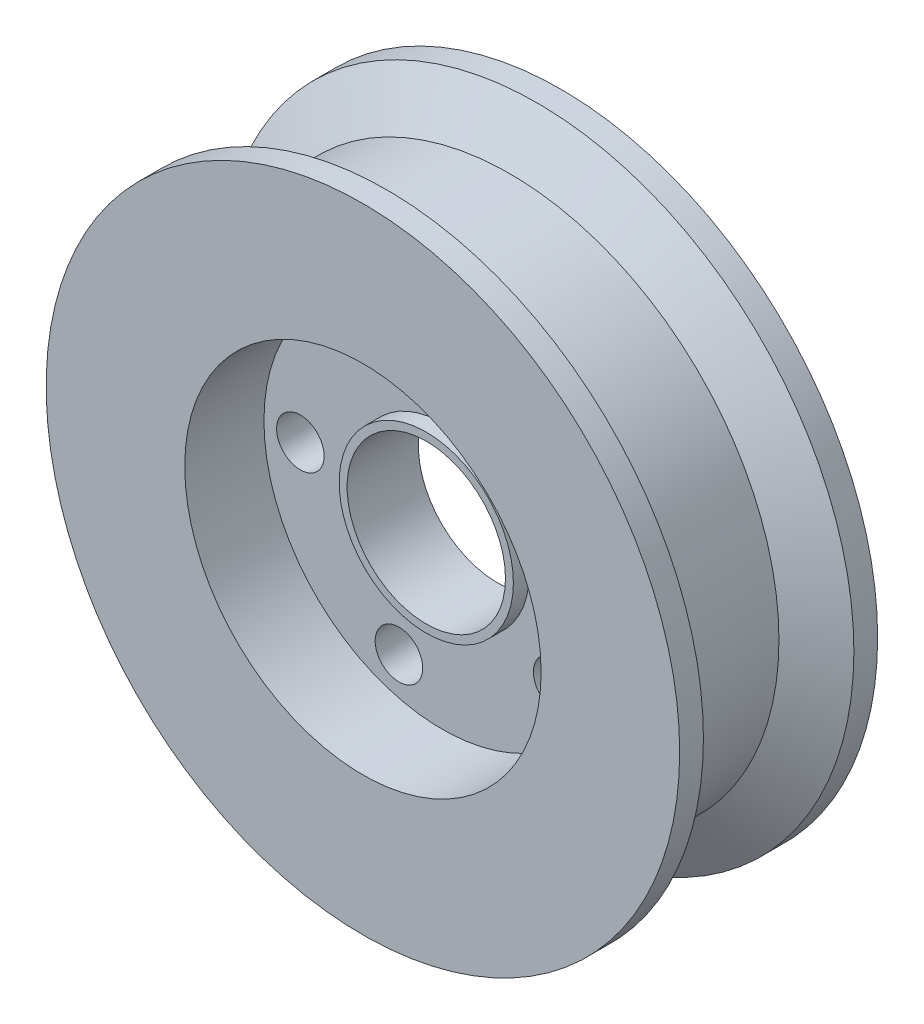
ISO-10303-21;
HEADER;
FILE_DESCRIPTION(('STEP AP214'),'2;1');
FILE_NAME('part.step','',(''),(''),'','','');
FILE_SCHEMA(('AUTOMOTIVE_DESIGN { 1 0 10303 214 1 1 1 1 }'));
ENDSEC;
DATA;
#1=APPLICATION_CONTEXT('core data for automotive mechanical design processes');
#2=APPLICATION_PROTOCOL_DEFINITION('international standard','automotive_design',2000,#1);
#3=PRODUCT_CONTEXT('',#1,'mechanical');
#4=PRODUCT('Part','Part','',(#3));
#5=PRODUCT_RELATED_PRODUCT_CATEGORY('part','',(#4));
#6=PRODUCT_DEFINITION_FORMATION('','',#4);
#7=PRODUCT_DEFINITION_CONTEXT('part definition',#1,'design');
#8=PRODUCT_DEFINITION('design','',#6,#7);
#9=PRODUCT_DEFINITION_SHAPE('','',#8);
#10=(LENGTH_UNIT() NAMED_UNIT(*) SI_UNIT(.MILLI.,.METRE.));
#11=(NAMED_UNIT(*) PLANE_ANGLE_UNIT() SI_UNIT($,.RADIAN.));
#12=(NAMED_UNIT(*) SI_UNIT($,.STERADIAN.) SOLID_ANGLE_UNIT());
#13=UNCERTAINTY_MEASURE_WITH_UNIT(LENGTH_MEASURE(1.E-05),#10,'distance_accuracy_value','');
#14=(GEOMETRIC_REPRESENTATION_CONTEXT(3) GLOBAL_UNCERTAINTY_ASSIGNED_CONTEXT((#13)) GLOBAL_UNIT_ASSIGNED_CONTEXT((#10,
#11,#12)) REPRESENTATION_CONTEXT('',''));
#15=CARTESIAN_POINT('',(0.,0.,0.));
#16=DIRECTION('',(0.,0.,1.));
#17=DIRECTION('',(1.,0.,0.));
#18=AXIS2_PLACEMENT_3D('',#15,#16,#17);
#19=CARTESIAN_POINT('',(0.,0.,12.5));
#20=DIRECTION('',(0.,0.,-1.));
#21=DIRECTION('',(-1.,0.,0.));
#22=AXIS2_PLACEMENT_3D('',#19,#20,#21);
#23=CYLINDRICAL_SURFACE('',#22,40.);
#24=CARTESIAN_POINT('',(0.,0.,12.5));
#25=DIRECTION('',(0.,0.,1.));
#26=DIRECTION('',(1.,0.,0.));
#27=AXIS2_PLACEMENT_3D('',#24,#25,#26);
#28=CIRCLE('',#27,40.);
#29=CARTESIAN_POINT('',(40.,0.,12.5));
#30=VERTEX_POINT('',#29);
#31=EDGE_CURVE('E48',#30,#30,#28,.T.);
#32=ORIENTED_EDGE('',*,*,#31,.F.);
#33=EDGE_LOOP('',(#32));
#34=FACE_BOUND('',#33,.T.);
#35=CARTESIAN_POINT('',(0.,0.,9.5));
#36=DIRECTION('',(0.,0.,1.));
#37=DIRECTION('',(1.,0.,0.));
#38=AXIS2_PLACEMENT_3D('',#35,#36,#37);
#39=CIRCLE('',#38,40.);
#40=CARTESIAN_POINT('',(40.,0.,9.5));
#41=VERTEX_POINT('',#40);
#42=EDGE_CURVE('E148',#41,#41,#39,.T.);
#43=ORIENTED_EDGE('',*,*,#42,.T.);
#44=EDGE_LOOP('',(#43));
#45=FACE_BOUND('',#44,.T.);
#46=ADVANCED_FACE('F37',(#34,#45),#23,.T.);
#47=CARTESIAN_POINT('',(0.,0.,-12.5));
#48=DIRECTION('',(0.,0.,1.));
#49=DIRECTION('',(1.,0.,0.));
#50=AXIS2_PLACEMENT_3D('',#47,#48,#49);
#51=CIRCLE('',#50,40.);
#52=CARTESIAN_POINT('',(40.,0.,-12.5));
#53=VERTEX_POINT('',#52);
#54=EDGE_CURVE('E83',#53,#53,#51,.T.);
#55=ORIENTED_EDGE('',*,*,#54,.T.);
#56=EDGE_LOOP('',(#55));
#57=FACE_BOUND('',#56,.T.);
#58=CARTESIAN_POINT('',(0.,0.,-9.5));
#59=DIRECTION('',(0.,0.,1.));
#60=DIRECTION('',(1.,0.,0.));
#61=AXIS2_PLACEMENT_3D('',#58,#59,#60);
#62=CIRCLE('',#61,40.);
#63=CARTESIAN_POINT('',(40.,0.,-9.5));
#64=VERTEX_POINT('',#63);
#65=EDGE_CURVE('E354',#64,#64,#62,.T.);
#66=ORIENTED_EDGE('',*,*,#65,.F.);
#67=EDGE_LOOP('',(#66));
#68=FACE_BOUND('',#67,.T.);
#69=ADVANCED_FACE('F129',(#57,#68),#23,.T.);
#70=CARTESIAN_POINT('',(0.,0.,-12.5));
#71=DIRECTION('',(0.,0.,1.));
#72=DIRECTION('',(1.,0.,0.));
#73=AXIS2_PLACEMENT_3D('',#70,#71,#72);
#74=PLANE('',#73);
#75=ORIENTED_EDGE('',*,*,#54,.F.);
#76=EDGE_LOOP('',(#75));
#77=FACE_BOUND('',#76,.T.);
#78=CARTESIAN_POINT('',(0.,0.,-12.5));
#79=DIRECTION('',(0.,0.,1.));
#80=DIRECTION('',(1.,0.,0.));
#81=AXIS2_PLACEMENT_3D('',#78,#79,#80);
#82=CIRCLE('',#81,22.5);
#83=CARTESIAN_POINT('',(22.5,0.,-12.5));
#84=VERTEX_POINT('',#83);
#85=EDGE_CURVE('E77',#84,#84,#82,.T.);
#86=ORIENTED_EDGE('',*,*,#85,.T.);
#87=EDGE_LOOP('',(#86));
#88=FACE_BOUND('',#87,.T.);
#89=ADVANCED_FACE('F126',(#77,#88),#74,.F.);
#90=CARTESIAN_POINT('',(0.,0.,12.5));
#91=DIRECTION('',(0.,0.,1.));
#92=DIRECTION('',(1.,0.,0.));
#93=AXIS2_PLACEMENT_3D('',#90,#91,#92);
#94=PLANE('',#93);
#95=CARTESIAN_POINT('',(0.,0.,12.5));
#96=DIRECTION('',(0.,0.,1.));
#97=DIRECTION('',(1.,0.,0.));
#98=AXIS2_PLACEMENT_3D('',#95,#96,#97);
#99=CIRCLE('',#98,22.5);
#100=CARTESIAN_POINT('',(22.5,0.,12.5));
#101=VERTEX_POINT('',#100);
#102=EDGE_CURVE('E76',#101,#101,#99,.T.);
#103=ORIENTED_EDGE('',*,*,#102,.F.);
#104=EDGE_LOOP('',(#103));
#105=FACE_BOUND('',#104,.T.);
#106=ORIENTED_EDGE('',*,*,#31,.T.);
#107=EDGE_LOOP('',(#106));
#108=FACE_BOUND('',#107,.T.);
#109=ADVANCED_FACE('F128',(#105,#108),#94,.T.);
#110=CARTESIAN_POINT('',(0.,0.,2.5));
#111=DIRECTION('',(0.,0.,1.));
#112=DIRECTION('',(1.,0.,0.));
#113=AXIS2_PLACEMENT_3D('',#110,#111,#112);
#114=CYLINDRICAL_SURFACE('',#113,22.5);
#115=CARTESIAN_POINT('',(0.,0.,2.5));
#116=DIRECTION('',(0.,0.,1.));
#117=DIRECTION('',(1.,0.,0.));
#118=AXIS2_PLACEMENT_3D('',#115,#116,#117);
#119=CIRCLE('',#118,22.5);
#120=CARTESIAN_POINT('',(22.5,0.,2.5));
#121=VERTEX_POINT('',#120);
#122=EDGE_CURVE('E80',#121,#121,#119,.T.);
#123=ORIENTED_EDGE('',*,*,#122,.F.);
#124=EDGE_LOOP('',(#123));
#125=FACE_BOUND('',#124,.T.);
#126=ORIENTED_EDGE('',*,*,#102,.T.);
#127=EDGE_LOOP('',(#126));
#128=FACE_BOUND('',#127,.T.);
#129=ADVANCED_FACE('F135',(#125,#128),#114,.F.);
#130=CARTESIAN_POINT('',(0.,0.,2.5));
#131=DIRECTION('',(0.,0.,1.));
#132=DIRECTION('',(1.,0.,0.));
#133=AXIS2_PLACEMENT_3D('',#130,#131,#132);
#134=PLANE('',#133);
#135=CARTESIAN_POINT('',(0.,0.,2.5));
#136=DIRECTION('',(0.,0.,1.));
#137=DIRECTION('',(1.,0.,0.));
#138=AXIS2_PLACEMENT_3D('',#135,#136,#137);
#139=CIRCLE('',#138,11.);
#140=CARTESIAN_POINT('',(11.,0.,2.5));
#141=VERTEX_POINT('',#140);
#142=EDGE_CURVE('E11',#141,#141,#139,.T.);
#143=ORIENTED_EDGE('',*,*,#142,.F.);
#144=EDGE_LOOP('',(#143));
#145=FACE_BOUND('',#144,.T.);
#146=CARTESIAN_POINT('',(-17.9017776136443,-0.082850630188919,2.5));
#147=DIRECTION('',(0.,0.,1.));
#148=DIRECTION('',(0.309016994374958,0.95105651629515,0.));
#149=AXIS2_PLACEMENT_3D('',#146,#147,#148);
#150=CIRCLE('',#149,3.);
#151=CARTESIAN_POINT('',(-14.9017776136443,-0.082850630188919,2.5));
#152=VERTEX_POINT('',#151);
#153=EDGE_CURVE('E53',#152,#152,#150,.T.);
#154=ORIENTED_EDGE('',*,*,#153,.F.);
#155=EDGE_LOOP('',(#154));
#156=FACE_BOUND('',#155,.T.);
#157=CARTESIAN_POINT('',(-5.4531578804167,-17.0512045054462,2.5));
#158=DIRECTION('',(0.,0.,1.));
#159=DIRECTION('',(-0.809016994374942,0.58778525229248,0.));
#160=AXIS2_PLACEMENT_3D('',#157,#158,#159);
#161=CIRCLE('',#160,3.);
#162=CARTESIAN_POINT('',(-2.4531578804167,-17.0512045054462,2.5));
#163=VERTEX_POINT('',#162);
#164=EDGE_CURVE('E57',#163,#163,#161,.T.);
#165=ORIENTED_EDGE('',*,*,#164,.F.);
#166=EDGE_LOOP('',(#165));
#167=FACE_BOUND('',#166,.T.);
#168=CARTESIAN_POINT('',(14.5315406975275,-10.4553733033021,2.5));
#169=DIRECTION('',(0.,0.,1.));
#170=DIRECTION('',(-0.809016994374951,-0.587785252292469,0.));
#171=AXIS2_PLACEMENT_3D('',#168,#169,#170);
#172=CIRCLE('',#171,3.);
#173=CARTESIAN_POINT('',(17.5315406975275,-10.4553733033021,2.5));
#174=VERTEX_POINT('',#173);
#175=EDGE_CURVE('E61',#174,#174,#172,.T.);
#176=ORIENTED_EDGE('',*,*,#175,.F.);
#177=EDGE_LOOP('',(#176));
#178=FACE_BOUND('',#177,.T.);
#179=CARTESIAN_POINT('',(14.434143940391,10.5894284389373,2.5));
#180=DIRECTION('',(0.,0.,1.));
#181=DIRECTION('',(0.309016994374945,-0.951056516295155,0.));
#182=AXIS2_PLACEMENT_3D('',#179,#180,#181);
#183=CIRCLE('',#182,3.);
#184=CARTESIAN_POINT('',(17.434143940391,10.5894284389373,2.5));
#185=VERTEX_POINT('',#184);
#186=EDGE_CURVE('E65',#185,#185,#183,.T.);
#187=ORIENTED_EDGE('',*,*,#186,.F.);
#188=EDGE_LOOP('',(#187));
#189=FACE_BOUND('',#188,.T.);
#190=CARTESIAN_POINT('',(-5.6107491438576,17.,2.5));
#191=DIRECTION('',(0.,0.,1.));
#192=DIRECTION('',(1.,0.,0.));
#193=AXIS2_PLACEMENT_3D('',#190,#191,#192);
#194=CIRCLE('',#193,3.);
#195=CARTESIAN_POINT('',(-2.6107491438576,17.,2.5));
#196=VERTEX_POINT('',#195);
#197=EDGE_CURVE('E69',#196,#196,#194,.T.);
#198=ORIENTED_EDGE('',*,*,#197,.F.);
#199=EDGE_LOOP('',(#198));
#200=FACE_BOUND('',#199,.T.);
#201=ORIENTED_EDGE('',*,*,#122,.T.);
#202=EDGE_LOOP('',(#201));
#203=FACE_BOUND('',#202,.T.);
#204=ADVANCED_FACE('F122',(#145,#156,#167,#178,#189,#200,#203),#134,.T.);
#205=CARTESIAN_POINT('',(0.,0.,-2.5));
#206=DIRECTION('',(0.,0.,-1.));
#207=DIRECTION('',(-1.,0.,0.));
#208=AXIS2_PLACEMENT_3D('',#205,#206,#207);
#209=CYLINDRICAL_SURFACE('',#208,22.5);
#210=CARTESIAN_POINT('',(0.,0.,-2.5));
#211=DIRECTION('',(0.,0.,1.));
#212=DIRECTION('',(1.,0.,0.));
#213=AXIS2_PLACEMENT_3D('',#210,#211,#212);
#214=CIRCLE('',#213,22.5);
#215=CARTESIAN_POINT('',(22.5,0.,-2.5));
#216=VERTEX_POINT('',#215);
#217=EDGE_CURVE('E73',#216,#216,#214,.T.);
#218=ORIENTED_EDGE('',*,*,#217,.T.);
#219=EDGE_LOOP('',(#218));
#220=FACE_BOUND('',#219,.T.);
#221=ORIENTED_EDGE('',*,*,#85,.F.);
#222=EDGE_LOOP('',(#221));
#223=FACE_BOUND('',#222,.T.);
#224=ADVANCED_FACE('F107',(#220,#223),#209,.F.);
#225=CARTESIAN_POINT('',(0.,0.,-2.5));
#226=DIRECTION('',(0.,0.,-1.));
#227=DIRECTION('',(1.,0.,0.));
#228=AXIS2_PLACEMENT_3D('',#225,#226,#227);
#229=PLANE('',#228);
#230=CARTESIAN_POINT('',(0.,0.,-2.5));
#231=DIRECTION('',(0.,0.,-1.));
#232=DIRECTION('',(-1.,0.,0.));
#233=AXIS2_PLACEMENT_3D('',#230,#231,#232);
#234=CIRCLE('',#233,11.);
#235=CARTESIAN_POINT('',(-11.,0.,-2.5));
#236=VERTEX_POINT('',#235);
#237=EDGE_CURVE('E40',#236,#236,#234,.T.);
#238=ORIENTED_EDGE('',*,*,#237,.F.);
#239=EDGE_LOOP('',(#238));
#240=FACE_BOUND('',#239,.T.);
#241=CARTESIAN_POINT('',(-17.9017776136443,-0.082850630188919,-2.5));
#242=DIRECTION('',(0.,0.,-1.));
#243=DIRECTION('',(-1.,0.,0.));
#244=AXIS2_PLACEMENT_3D('',#241,#242,#243);
#245=CIRCLE('',#244,3.);
#246=CARTESIAN_POINT('',(-14.9017776136443,-0.082850630188919,-2.5));
#247=VERTEX_POINT('',#246);
#248=EDGE_CURVE('E56',#247,#247,#245,.T.);
#249=ORIENTED_EDGE('',*,*,#248,.F.);
#250=EDGE_LOOP('',(#249));
#251=FACE_BOUND('',#250,.T.);
#252=CARTESIAN_POINT('',(-5.4531578804167,-17.0512045054462,-2.5));
#253=DIRECTION('',(0.,0.,-1.));
#254=DIRECTION('',(-1.,0.,0.));
#255=AXIS2_PLACEMENT_3D('',#252,#253,#254);
#256=CIRCLE('',#255,3.);
#257=CARTESIAN_POINT('',(-2.4531578804167,-17.0512045054462,-2.5));
#258=VERTEX_POINT('',#257);
#259=EDGE_CURVE('E60',#258,#258,#256,.T.);
#260=ORIENTED_EDGE('',*,*,#259,.F.);
#261=EDGE_LOOP('',(#260));
#262=FACE_BOUND('',#261,.T.);
#263=CARTESIAN_POINT('',(14.5315406975275,-10.4553733033021,-2.5));
#264=DIRECTION('',(0.,0.,-1.));
#265=DIRECTION('',(-1.,0.,0.));
#266=AXIS2_PLACEMENT_3D('',#263,#264,#265);
#267=CIRCLE('',#266,3.);
#268=CARTESIAN_POINT('',(17.5315406975275,-10.4553733033021,-2.5));
#269=VERTEX_POINT('',#268);
#270=EDGE_CURVE('E64',#269,#269,#267,.T.);
#271=ORIENTED_EDGE('',*,*,#270,.F.);
#272=EDGE_LOOP('',(#271));
#273=FACE_BOUND('',#272,.T.);
#274=CARTESIAN_POINT('',(14.434143940391,10.5894284389373,-2.5));
#275=DIRECTION('',(0.,0.,-1.));
#276=DIRECTION('',(-1.,0.,0.));
#277=AXIS2_PLACEMENT_3D('',#274,#275,#276);
#278=CIRCLE('',#277,3.);
#279=CARTESIAN_POINT('',(17.434143940391,10.5894284389373,-2.5));
#280=VERTEX_POINT('',#279);
#281=EDGE_CURVE('E68',#280,#280,#278,.T.);
#282=ORIENTED_EDGE('',*,*,#281,.F.);
#283=EDGE_LOOP('',(#282));
#284=FACE_BOUND('',#283,.T.);
#285=CARTESIAN_POINT('',(-5.6107491438576,17.,-2.5));
#286=DIRECTION('',(0.,0.,-1.));
#287=DIRECTION('',(-1.,0.,0.));
#288=AXIS2_PLACEMENT_3D('',#285,#286,#287);
#289=CIRCLE('',#288,3.);
#290=CARTESIAN_POINT('',(-2.6107491438576,17.,-2.5));
#291=VERTEX_POINT('',#290);
#292=EDGE_CURVE('E72',#291,#291,#289,.T.);
#293=ORIENTED_EDGE('',*,*,#292,.F.);
#294=EDGE_LOOP('',(#293));
#295=FACE_BOUND('',#294,.T.);
#296=ORIENTED_EDGE('',*,*,#217,.F.);
#297=EDGE_LOOP('',(#296));
#298=FACE_BOUND('',#297,.T.);
#299=ADVANCED_FACE('F103',(#240,#251,#262,#273,#284,#295,#298),#229,.T.);
#300=CARTESIAN_POINT('',(-5.6107491438576,17.,-12.5));
#301=DIRECTION('',(0.,0.,1.));
#302=DIRECTION('',(1.,0.,0.));
#303=AXIS2_PLACEMENT_3D('',#300,#301,#302);
#304=CYLINDRICAL_SURFACE('',#303,3.);
#305=CARTESIAN_POINT('',(-2.6107491438576,17.,-2.5));
#306=CARTESIAN_POINT('',(-2.6107491438576,17.,-2.44791666666667));
#307=CARTESIAN_POINT('',(-2.6107491438576,17.,-2.39583333333333));
#308=CARTESIAN_POINT('',(-2.6107491438576,17.,-2.29166666666667));
#309=CARTESIAN_POINT('',(-2.6107491438576,17.,-2.23958333333333));
#310=CARTESIAN_POINT('',(-2.6107491438576,17.,-2.13541666666667));
#311=CARTESIAN_POINT('',(-2.6107491438576,17.,-2.08333333333333));
#312=CARTESIAN_POINT('',(-2.6107491438576,17.,-1.97916666666667));
#313=CARTESIAN_POINT('',(-2.6107491438576,17.,-1.92708333333333));
#314=CARTESIAN_POINT('',(-2.6107491438576,17.,-1.82291666666667));
#315=CARTESIAN_POINT('',(-2.6107491438576,17.,-1.77083333333333));
#316=CARTESIAN_POINT('',(-2.6107491438576,17.,-1.66666666666667));
#317=CARTESIAN_POINT('',(-2.6107491438576,17.,-1.61458333333333));
#318=CARTESIAN_POINT('',(-2.6107491438576,17.,-1.51041666666667));
#319=CARTESIAN_POINT('',(-2.6107491438576,17.,-1.45833333333333));
#320=CARTESIAN_POINT('',(-2.6107491438576,17.,-1.35416666666667));
#321=CARTESIAN_POINT('',(-2.6107491438576,17.,-1.30208333333333));
#322=CARTESIAN_POINT('',(-2.6107491438576,17.,-1.19791666666667));
#323=CARTESIAN_POINT('',(-2.6107491438576,17.,-1.14583333333333));
#324=CARTESIAN_POINT('',(-2.6107491438576,17.,-1.04166666666667));
#325=CARTESIAN_POINT('',(-2.6107491438576,17.,-0.989583333333334));
#326=CARTESIAN_POINT('',(-2.6107491438576,17.,-0.885416666666668));
#327=CARTESIAN_POINT('',(-2.6107491438576,17.,-0.833333333333334));
#328=CARTESIAN_POINT('',(-2.6107491438576,17.,-0.729166666666667));
#329=CARTESIAN_POINT('',(-2.6107491438576,17.,-0.677083333333334));
#330=CARTESIAN_POINT('',(-2.6107491438576,17.,-0.572916666666667));
#331=CARTESIAN_POINT('',(-2.6107491438576,17.,-0.520833333333334));
#332=CARTESIAN_POINT('',(-2.6107491438576,17.,-0.416666666666667));
#333=CARTESIAN_POINT('',(-2.6107491438576,17.,-0.364583333333334));
#334=CARTESIAN_POINT('',(-2.6107491438576,17.,-0.260416666666667));
#335=CARTESIAN_POINT('',(-2.6107491438576,17.,-0.208333333333334));
#336=CARTESIAN_POINT('',(-2.6107491438576,17.,-0.104166666666667));
#337=CARTESIAN_POINT('',(-2.6107491438576,17.,-0.0520833333333334));
#338=CARTESIAN_POINT('',(-2.6107491438576,17.,0.0520833333333334));
#339=CARTESIAN_POINT('',(-2.6107491438576,17.,0.104166666666667));
#340=CARTESIAN_POINT('',(-2.6107491438576,17.,0.208333333333334));
#341=CARTESIAN_POINT('',(-2.6107491438576,17.,0.260416666666667));
#342=CARTESIAN_POINT('',(-2.6107491438576,17.,0.364583333333334));
#343=CARTESIAN_POINT('',(-2.6107491438576,17.,0.416666666666667));
#344=CARTESIAN_POINT('',(-2.6107491438576,17.,0.520833333333334));
#345=CARTESIAN_POINT('',(-2.6107491438576,17.,0.572916666666667));
#346=CARTESIAN_POINT('',(-2.6107491438576,17.,0.677083333333334));
#347=CARTESIAN_POINT('',(-2.6107491438576,17.,0.729166666666667));
#348=CARTESIAN_POINT('',(-2.6107491438576,17.,0.833333333333333));
#349=CARTESIAN_POINT('',(-2.6107491438576,17.,0.885416666666666));
#350=CARTESIAN_POINT('',(-2.6107491438576,17.,0.989583333333333));
#351=CARTESIAN_POINT('',(-2.6107491438576,17.,1.04166666666667));
#352=CARTESIAN_POINT('',(-2.6107491438576,17.,1.14583333333333));
#353=CARTESIAN_POINT('',(-2.6107491438576,17.,1.19791666666667));
#354=CARTESIAN_POINT('',(-2.6107491438576,17.,1.30208333333333));
#355=CARTESIAN_POINT('',(-2.6107491438576,17.,1.35416666666667));
#356=CARTESIAN_POINT('',(-2.6107491438576,17.,1.45833333333333));
#357=CARTESIAN_POINT('',(-2.6107491438576,17.,1.51041666666667));
#358=CARTESIAN_POINT('',(-2.6107491438576,17.,1.61458333333333));
#359=CARTESIAN_POINT('',(-2.6107491438576,17.,1.66666666666667));
#360=CARTESIAN_POINT('',(-2.6107491438576,17.,1.77083333333333));
#361=CARTESIAN_POINT('',(-2.6107491438576,17.,1.82291666666667));
#362=CARTESIAN_POINT('',(-2.6107491438576,17.,1.92708333333333));
#363=CARTESIAN_POINT('',(-2.6107491438576,17.,1.97916666666667));
#364=CARTESIAN_POINT('',(-2.6107491438576,17.,2.08333333333333));
#365=CARTESIAN_POINT('',(-2.6107491438576,17.,2.13541666666667));
#366=CARTESIAN_POINT('',(-2.6107491438576,17.,2.23958333333333));
#367=CARTESIAN_POINT('',(-2.6107491438576,17.,2.29166666666667));
#368=CARTESIAN_POINT('',(-2.6107491438576,17.,2.39583333333333));
#369=CARTESIAN_POINT('',(-2.6107491438576,17.,2.44791666666667));
#370=CARTESIAN_POINT('',(-2.6107491438576,17.,2.5));
#371=B_SPLINE_CURVE_WITH_KNOTS('',3,(#305,#306,#307,#308,#309,#310,#311,#312,#313,#314,#315,
#316,#317,#318,#319,#320,#321,#322,#323,#324,#325,#326,#327,#328,#329,#330,#331,#332,#333,#334,
#335,#336,#337,#338,#339,#340,#341,#342,#343,#344,#345,#346,#347,#348,#349,#350,#351,#352,#353,
#354,#355,#356,#357,#358,#359,#360,#361,#362,#363,#364,#365,#366,#367,#368,#369,#370),
.UNSPECIFIED.,.F.,.F.,(4,2,2,2,2,2,2,2,2,2,2,2,2,2,2,2,2,2,2,2,2,2,2,2,2,2,2,2,2,2,2,2,4),(0.,
0.15625,0.3125,0.46875,0.625000000000001,0.781250000000001,0.937500000000001,1.09375,1.25,
1.40625,1.5625,1.71875,1.875,2.03125,2.1875,2.34375,2.5,2.65625,2.8125,2.96875,3.125,3.28125,
3.4375,3.59375,3.75,3.90625,4.0625,4.21875,4.375,4.53125,4.6875,4.84375,5.),.UNSPECIFIED.);
#372=EDGE_CURVE('BSEAM106',#291,#196,#371,.T.);
#373=ORIENTED_EDGE('',*,*,#292,.T.);
#374=ORIENTED_EDGE('',*,*,#197,.T.);
#375=ORIENTED_EDGE('',*,*,#372,.T.);
#376=ORIENTED_EDGE('',*,*,#372,.F.);
#377=EDGE_LOOP('',(#373,#375,#374,#376));
#378=FACE_BOUND('',#377,.T.);
#379=ADVANCED_FACE('F106',(#378),#304,.F.);
#380=CARTESIAN_POINT('',(14.434143940391,10.5894284389373,-12.5));
#381=DIRECTION('',(0.,0.,1.));
#382=DIRECTION('',(1.,0.,0.));
#383=AXIS2_PLACEMENT_3D('',#380,#381,#382);
#384=CYLINDRICAL_SURFACE('',#383,3.);
#385=CARTESIAN_POINT('',(17.434143940391,10.5894284389373,-2.5));
#386=CARTESIAN_POINT('',(17.434143940391,10.5894284389373,-2.44791666666667));
#387=CARTESIAN_POINT('',(17.434143940391,10.5894284389373,-2.39583333333333));
#388=CARTESIAN_POINT('',(17.434143940391,10.5894284389373,-2.29166666666667));
#389=CARTESIAN_POINT('',(17.434143940391,10.5894284389373,-2.23958333333333));
#390=CARTESIAN_POINT('',(17.434143940391,10.5894284389373,-2.13541666666667));
#391=CARTESIAN_POINT('',(17.434143940391,10.5894284389373,-2.08333333333333));
#392=CARTESIAN_POINT('',(17.434143940391,10.5894284389373,-1.97916666666667));
#393=CARTESIAN_POINT('',(17.434143940391,10.5894284389373,-1.92708333333333));
#394=CARTESIAN_POINT('',(17.434143940391,10.5894284389373,-1.82291666666667));
#395=CARTESIAN_POINT('',(17.434143940391,10.5894284389373,-1.77083333333333));
#396=CARTESIAN_POINT('',(17.434143940391,10.5894284389373,-1.66666666666667));
#397=CARTESIAN_POINT('',(17.434143940391,10.5894284389373,-1.61458333333333));
#398=CARTESIAN_POINT('',(17.434143940391,10.5894284389373,-1.51041666666667));
#399=CARTESIAN_POINT('',(17.434143940391,10.5894284389373,-1.45833333333333));
#400=CARTESIAN_POINT('',(17.434143940391,10.5894284389373,-1.35416666666667));
#401=CARTESIAN_POINT('',(17.434143940391,10.5894284389373,-1.30208333333333));
#402=CARTESIAN_POINT('',(17.434143940391,10.5894284389373,-1.19791666666667));
#403=CARTESIAN_POINT('',(17.434143940391,10.5894284389373,-1.14583333333333));
#404=CARTESIAN_POINT('',(17.434143940391,10.5894284389373,-1.04166666666667));
#405=CARTESIAN_POINT('',(17.434143940391,10.5894284389373,-0.989583333333334));
#406=CARTESIAN_POINT('',(17.434143940391,10.5894284389373,-0.885416666666668));
#407=CARTESIAN_POINT('',(17.434143940391,10.5894284389373,-0.833333333333334));
#408=CARTESIAN_POINT('',(17.434143940391,10.5894284389373,-0.729166666666667));
#409=CARTESIAN_POINT('',(17.434143940391,10.5894284389373,-0.677083333333334));
#410=CARTESIAN_POINT('',(17.434143940391,10.5894284389373,-0.572916666666667));
#411=CARTESIAN_POINT('',(17.434143940391,10.5894284389373,-0.520833333333334));
#412=CARTESIAN_POINT('',(17.434143940391,10.5894284389373,-0.416666666666667));
#413=CARTESIAN_POINT('',(17.434143940391,10.5894284389373,-0.364583333333334));
#414=CARTESIAN_POINT('',(17.434143940391,10.5894284389373,-0.260416666666667));
#415=CARTESIAN_POINT('',(17.434143940391,10.5894284389373,-0.208333333333334));
#416=CARTESIAN_POINT('',(17.434143940391,10.5894284389373,-0.104166666666667));
#417=CARTESIAN_POINT('',(17.434143940391,10.5894284389373,-0.0520833333333334));
#418=CARTESIAN_POINT('',(17.434143940391,10.5894284389373,0.0520833333333334));
#419=CARTESIAN_POINT('',(17.434143940391,10.5894284389373,0.104166666666667));
#420=CARTESIAN_POINT('',(17.434143940391,10.5894284389373,0.208333333333334));
#421=CARTESIAN_POINT('',(17.434143940391,10.5894284389373,0.260416666666667));
#422=CARTESIAN_POINT('',(17.434143940391,10.5894284389373,0.364583333333334));
#423=CARTESIAN_POINT('',(17.434143940391,10.5894284389373,0.416666666666667));
#424=CARTESIAN_POINT('',(17.434143940391,10.5894284389373,0.520833333333334));
#425=CARTESIAN_POINT('',(17.434143940391,10.5894284389373,0.572916666666667));
#426=CARTESIAN_POINT('',(17.434143940391,10.5894284389373,0.677083333333334));
#427=CARTESIAN_POINT('',(17.434143940391,10.5894284389373,0.729166666666667));
#428=CARTESIAN_POINT('',(17.434143940391,10.5894284389373,0.833333333333333));
#429=CARTESIAN_POINT('',(17.434143940391,10.5894284389373,0.885416666666666));
#430=CARTESIAN_POINT('',(17.434143940391,10.5894284389373,0.989583333333333));
#431=CARTESIAN_POINT('',(17.434143940391,10.5894284389373,1.04166666666667));
#432=CARTESIAN_POINT('',(17.434143940391,10.5894284389373,1.14583333333333));
#433=CARTESIAN_POINT('',(17.434143940391,10.5894284389373,1.19791666666667));
#434=CARTESIAN_POINT('',(17.434143940391,10.5894284389373,1.30208333333333));
#435=CARTESIAN_POINT('',(17.434143940391,10.5894284389373,1.35416666666667));
#436=CARTESIAN_POINT('',(17.434143940391,10.5894284389373,1.45833333333333));
#437=CARTESIAN_POINT('',(17.434143940391,10.5894284389373,1.51041666666667));
#438=CARTESIAN_POINT('',(17.434143940391,10.5894284389373,1.61458333333333));
#439=CARTESIAN_POINT('',(17.434143940391,10.5894284389373,1.66666666666667));
#440=CARTESIAN_POINT('',(17.434143940391,10.5894284389373,1.77083333333333));
#441=CARTESIAN_POINT('',(17.434143940391,10.5894284389373,1.82291666666667));
#442=CARTESIAN_POINT('',(17.434143940391,10.5894284389373,1.92708333333333));
#443=CARTESIAN_POINT('',(17.434143940391,10.5894284389373,1.97916666666667));
#444=CARTESIAN_POINT('',(17.434143940391,10.5894284389373,2.08333333333333));
#445=CARTESIAN_POINT('',(17.434143940391,10.5894284389373,2.13541666666667));
#446=CARTESIAN_POINT('',(17.434143940391,10.5894284389373,2.23958333333333));
#447=CARTESIAN_POINT('',(17.434143940391,10.5894284389373,2.29166666666667));
#448=CARTESIAN_POINT('',(17.434143940391,10.5894284389373,2.39583333333333));
#449=CARTESIAN_POINT('',(17.434143940391,10.5894284389373,2.44791666666667));
#450=CARTESIAN_POINT('',(17.434143940391,10.5894284389373,2.5));
#451=B_SPLINE_CURVE_WITH_KNOTS('',3,(#385,#386,#387,#388,#389,#390,#391,#392,#393,#394,#395,
#396,#397,#398,#399,#400,#401,#402,#403,#404,#405,#406,#407,#408,#409,#410,#411,#412,#413,#414,
#415,#416,#417,#418,#419,#420,#421,#422,#423,#424,#425,#426,#427,#428,#429,#430,#431,#432,#433,
#434,#435,#436,#437,#438,#439,#440,#441,#442,#443,#444,#445,#446,#447,#448,#449,#450),
.UNSPECIFIED.,.F.,.F.,(4,2,2,2,2,2,2,2,2,2,2,2,2,2,2,2,2,2,2,2,2,2,2,2,2,2,2,2,2,2,2,2,4),(0.,
0.15625,0.3125,0.46875,0.625000000000001,0.781250000000001,0.937500000000001,1.09375,1.25,
1.40625,1.5625,1.71875,1.875,2.03125,2.1875,2.34375,2.5,2.65625,2.8125,2.96875,3.125,3.28125,
3.4375,3.59375,3.75,3.90625,4.0625,4.21875,4.375,4.53125,4.6875,4.84375,5.),.UNSPECIFIED.);
#452=EDGE_CURVE('BSEAM194',#280,#185,#451,.T.);
#453=ORIENTED_EDGE('',*,*,#281,.T.);
#454=ORIENTED_EDGE('',*,*,#186,.T.);
#455=ORIENTED_EDGE('',*,*,#452,.T.);
#456=ORIENTED_EDGE('',*,*,#452,.F.);
#457=EDGE_LOOP('',(#453,#455,#454,#456));
#458=FACE_BOUND('',#457,.T.);
#459=ADVANCED_FACE('F194',(#458),#384,.F.);
#460=CARTESIAN_POINT('',(14.5315406975275,-10.4553733033021,-12.5));
#461=DIRECTION('',(0.,0.,1.));
#462=DIRECTION('',(1.,0.,0.));
#463=AXIS2_PLACEMENT_3D('',#460,#461,#462);
#464=CYLINDRICAL_SURFACE('',#463,3.);
#465=CARTESIAN_POINT('',(17.5315406975275,-10.4553733033021,-2.5));
#466=CARTESIAN_POINT('',(17.5315406975275,-10.4553733033021,-2.44791666666667));
#467=CARTESIAN_POINT('',(17.5315406975275,-10.4553733033021,-2.39583333333333));
#468=CARTESIAN_POINT('',(17.5315406975275,-10.4553733033021,-2.29166666666667));
#469=CARTESIAN_POINT('',(17.5315406975275,-10.4553733033021,-2.23958333333333));
#470=CARTESIAN_POINT('',(17.5315406975275,-10.4553733033021,-2.13541666666667));
#471=CARTESIAN_POINT('',(17.5315406975275,-10.4553733033021,-2.08333333333333));
#472=CARTESIAN_POINT('',(17.5315406975275,-10.4553733033021,-1.97916666666667));
#473=CARTESIAN_POINT('',(17.5315406975275,-10.4553733033021,-1.92708333333333));
#474=CARTESIAN_POINT('',(17.5315406975275,-10.4553733033021,-1.82291666666667));
#475=CARTESIAN_POINT('',(17.5315406975275,-10.4553733033021,-1.77083333333333));
#476=CARTESIAN_POINT('',(17.5315406975275,-10.4553733033021,-1.66666666666667));
#477=CARTESIAN_POINT('',(17.5315406975275,-10.4553733033021,-1.61458333333333));
#478=CARTESIAN_POINT('',(17.5315406975275,-10.4553733033021,-1.51041666666667));
#479=CARTESIAN_POINT('',(17.5315406975275,-10.4553733033021,-1.45833333333333));
#480=CARTESIAN_POINT('',(17.5315406975275,-10.4553733033021,-1.35416666666667));
#481=CARTESIAN_POINT('',(17.5315406975275,-10.4553733033021,-1.30208333333333));
#482=CARTESIAN_POINT('',(17.5315406975275,-10.4553733033021,-1.19791666666667));
#483=CARTESIAN_POINT('',(17.5315406975275,-10.4553733033021,-1.14583333333333));
#484=CARTESIAN_POINT('',(17.5315406975275,-10.4553733033021,-1.04166666666667));
#485=CARTESIAN_POINT('',(17.5315406975275,-10.4553733033021,-0.989583333333334));
#486=CARTESIAN_POINT('',(17.5315406975275,-10.4553733033021,-0.885416666666668));
#487=CARTESIAN_POINT('',(17.5315406975275,-10.4553733033021,-0.833333333333334));
#488=CARTESIAN_POINT('',(17.5315406975275,-10.4553733033021,-0.729166666666667));
#489=CARTESIAN_POINT('',(17.5315406975275,-10.4553733033021,-0.677083333333334));
#490=CARTESIAN_POINT('',(17.5315406975275,-10.4553733033021,-0.572916666666667));
#491=CARTESIAN_POINT('',(17.5315406975275,-10.4553733033021,-0.520833333333334));
#492=CARTESIAN_POINT('',(17.5315406975275,-10.4553733033021,-0.416666666666667));
#493=CARTESIAN_POINT('',(17.5315406975275,-10.4553733033021,-0.364583333333334));
#494=CARTESIAN_POINT('',(17.5315406975275,-10.4553733033021,-0.260416666666667));
#495=CARTESIAN_POINT('',(17.5315406975275,-10.4553733033021,-0.208333333333334));
#496=CARTESIAN_POINT('',(17.5315406975275,-10.4553733033021,-0.104166666666667));
#497=CARTESIAN_POINT('',(17.5315406975275,-10.4553733033021,-0.0520833333333334));
#498=CARTESIAN_POINT('',(17.5315406975275,-10.4553733033021,0.0520833333333334));
#499=CARTESIAN_POINT('',(17.5315406975275,-10.4553733033021,0.104166666666667));
#500=CARTESIAN_POINT('',(17.5315406975275,-10.4553733033021,0.208333333333334));
#501=CARTESIAN_POINT('',(17.5315406975275,-10.4553733033021,0.260416666666667));
#502=CARTESIAN_POINT('',(17.5315406975275,-10.4553733033021,0.364583333333334));
#503=CARTESIAN_POINT('',(17.5315406975275,-10.4553733033021,0.416666666666667));
#504=CARTESIAN_POINT('',(17.5315406975275,-10.4553733033021,0.520833333333334));
#505=CARTESIAN_POINT('',(17.5315406975275,-10.4553733033021,0.572916666666667));
#506=CARTESIAN_POINT('',(17.5315406975275,-10.4553733033021,0.677083333333334));
#507=CARTESIAN_POINT('',(17.5315406975275,-10.4553733033021,0.729166666666667));
#508=CARTESIAN_POINT('',(17.5315406975275,-10.4553733033021,0.833333333333333));
#509=CARTESIAN_POINT('',(17.5315406975275,-10.4553733033021,0.885416666666666));
#510=CARTESIAN_POINT('',(17.5315406975275,-10.4553733033021,0.989583333333333));
#511=CARTESIAN_POINT('',(17.5315406975275,-10.4553733033021,1.04166666666667));
#512=CARTESIAN_POINT('',(17.5315406975275,-10.4553733033021,1.14583333333333));
#513=CARTESIAN_POINT('',(17.5315406975275,-10.4553733033021,1.19791666666667));
#514=CARTESIAN_POINT('',(17.5315406975275,-10.4553733033021,1.30208333333333));
#515=CARTESIAN_POINT('',(17.5315406975275,-10.4553733033021,1.35416666666667));
#516=CARTESIAN_POINT('',(17.5315406975275,-10.4553733033021,1.45833333333333));
#517=CARTESIAN_POINT('',(17.5315406975275,-10.4553733033021,1.51041666666667));
#518=CARTESIAN_POINT('',(17.5315406975275,-10.4553733033021,1.61458333333333));
#519=CARTESIAN_POINT('',(17.5315406975275,-10.4553733033021,1.66666666666667));
#520=CARTESIAN_POINT('',(17.5315406975275,-10.4553733033021,1.77083333333333));
#521=CARTESIAN_POINT('',(17.5315406975275,-10.4553733033021,1.82291666666667));
#522=CARTESIAN_POINT('',(17.5315406975275,-10.4553733033021,1.92708333333333));
#523=CARTESIAN_POINT('',(17.5315406975275,-10.4553733033021,1.97916666666667));
#524=CARTESIAN_POINT('',(17.5315406975275,-10.4553733033021,2.08333333333333));
#525=CARTESIAN_POINT('',(17.5315406975275,-10.4553733033021,2.13541666666667));
#526=CARTESIAN_POINT('',(17.5315406975275,-10.4553733033021,2.23958333333333));
#527=CARTESIAN_POINT('',(17.5315406975275,-10.4553733033021,2.29166666666667));
#528=CARTESIAN_POINT('',(17.5315406975275,-10.4553733033021,2.39583333333333));
#529=CARTESIAN_POINT('',(17.5315406975275,-10.4553733033021,2.44791666666667));
#530=CARTESIAN_POINT('',(17.5315406975275,-10.4553733033021,2.5));
#531=B_SPLINE_CURVE_WITH_KNOTS('',3,(#465,#466,#467,#468,#469,#470,#471,#472,#473,#474,#475,
#476,#477,#478,#479,#480,#481,#482,#483,#484,#485,#486,#487,#488,#489,#490,#491,#492,#493,#494,
#495,#496,#497,#498,#499,#500,#501,#502,#503,#504,#505,#506,#507,#508,#509,#510,#511,#512,#513,
#514,#515,#516,#517,#518,#519,#520,#521,#522,#523,#524,#525,#526,#527,#528,#529,#530),
.UNSPECIFIED.,.F.,.F.,(4,2,2,2,2,2,2,2,2,2,2,2,2,2,2,2,2,2,2,2,2,2,2,2,2,2,2,2,2,2,2,2,4),(0.,
0.15625,0.3125,0.46875,0.625000000000001,0.781250000000001,0.937500000000001,1.09375,1.25,
1.40625,1.5625,1.71875,1.875,2.03125,2.1875,2.34375,2.5,2.65625,2.8125,2.96875,3.125,3.28125,
3.4375,3.59375,3.75,3.90625,4.0625,4.21875,4.375,4.53125,4.6875,4.84375,5.),.UNSPECIFIED.);
#532=EDGE_CURVE('BSEAM190',#269,#174,#531,.T.);
#533=ORIENTED_EDGE('',*,*,#270,.T.);
#534=ORIENTED_EDGE('',*,*,#175,.T.);
#535=ORIENTED_EDGE('',*,*,#532,.T.);
#536=ORIENTED_EDGE('',*,*,#532,.F.);
#537=EDGE_LOOP('',(#533,#535,#534,#536));
#538=FACE_BOUND('',#537,.T.);
#539=ADVANCED_FACE('F190',(#538),#464,.F.);
#540=CARTESIAN_POINT('',(-5.4531578804167,-17.0512045054462,-12.5));
#541=DIRECTION('',(0.,0.,1.));
#542=DIRECTION('',(1.,0.,0.));
#543=AXIS2_PLACEMENT_3D('',#540,#541,#542);
#544=CYLINDRICAL_SURFACE('',#543,3.);
#545=CARTESIAN_POINT('',(-2.4531578804167,-17.0512045054462,-2.5));
#546=CARTESIAN_POINT('',(-2.4531578804167,-17.0512045054462,-2.44791666666667));
#547=CARTESIAN_POINT('',(-2.4531578804167,-17.0512045054462,-2.39583333333333));
#548=CARTESIAN_POINT('',(-2.4531578804167,-17.0512045054462,-2.29166666666667));
#549=CARTESIAN_POINT('',(-2.4531578804167,-17.0512045054462,-2.23958333333333));
#550=CARTESIAN_POINT('',(-2.4531578804167,-17.0512045054462,-2.13541666666667));
#551=CARTESIAN_POINT('',(-2.4531578804167,-17.0512045054462,-2.08333333333333));
#552=CARTESIAN_POINT('',(-2.4531578804167,-17.0512045054462,-1.97916666666667));
#553=CARTESIAN_POINT('',(-2.4531578804167,-17.0512045054462,-1.92708333333333));
#554=CARTESIAN_POINT('',(-2.4531578804167,-17.0512045054462,-1.82291666666667));
#555=CARTESIAN_POINT('',(-2.4531578804167,-17.0512045054462,-1.77083333333333));
#556=CARTESIAN_POINT('',(-2.4531578804167,-17.0512045054462,-1.66666666666667));
#557=CARTESIAN_POINT('',(-2.4531578804167,-17.0512045054462,-1.61458333333333));
#558=CARTESIAN_POINT('',(-2.4531578804167,-17.0512045054462,-1.51041666666667));
#559=CARTESIAN_POINT('',(-2.4531578804167,-17.0512045054462,-1.45833333333333));
#560=CARTESIAN_POINT('',(-2.4531578804167,-17.0512045054462,-1.35416666666667));
#561=CARTESIAN_POINT('',(-2.4531578804167,-17.0512045054462,-1.30208333333333));
#562=CARTESIAN_POINT('',(-2.4531578804167,-17.0512045054462,-1.19791666666667));
#563=CARTESIAN_POINT('',(-2.4531578804167,-17.0512045054462,-1.14583333333333));
#564=CARTESIAN_POINT('',(-2.4531578804167,-17.0512045054462,-1.04166666666667));
#565=CARTESIAN_POINT('',(-2.4531578804167,-17.0512045054462,-0.989583333333334));
#566=CARTESIAN_POINT('',(-2.4531578804167,-17.0512045054462,-0.885416666666668));
#567=CARTESIAN_POINT('',(-2.4531578804167,-17.0512045054462,-0.833333333333334));
#568=CARTESIAN_POINT('',(-2.4531578804167,-17.0512045054462,-0.729166666666667));
#569=CARTESIAN_POINT('',(-2.4531578804167,-17.0512045054462,-0.677083333333334));
#570=CARTESIAN_POINT('',(-2.4531578804167,-17.0512045054462,-0.572916666666667));
#571=CARTESIAN_POINT('',(-2.4531578804167,-17.0512045054462,-0.520833333333334));
#572=CARTESIAN_POINT('',(-2.4531578804167,-17.0512045054462,-0.416666666666667));
#573=CARTESIAN_POINT('',(-2.4531578804167,-17.0512045054462,-0.364583333333334));
#574=CARTESIAN_POINT('',(-2.4531578804167,-17.0512045054462,-0.260416666666667));
#575=CARTESIAN_POINT('',(-2.4531578804167,-17.0512045054462,-0.208333333333334));
#576=CARTESIAN_POINT('',(-2.4531578804167,-17.0512045054462,-0.104166666666667));
#577=CARTESIAN_POINT('',(-2.4531578804167,-17.0512045054462,-0.0520833333333334));
#578=CARTESIAN_POINT('',(-2.4531578804167,-17.0512045054462,0.0520833333333334));
#579=CARTESIAN_POINT('',(-2.4531578804167,-17.0512045054462,0.104166666666667));
#580=CARTESIAN_POINT('',(-2.4531578804167,-17.0512045054462,0.208333333333334));
#581=CARTESIAN_POINT('',(-2.4531578804167,-17.0512045054462,0.260416666666667));
#582=CARTESIAN_POINT('',(-2.4531578804167,-17.0512045054462,0.364583333333334));
#583=CARTESIAN_POINT('',(-2.4531578804167,-17.0512045054462,0.416666666666667));
#584=CARTESIAN_POINT('',(-2.4531578804167,-17.0512045054462,0.520833333333334));
#585=CARTESIAN_POINT('',(-2.4531578804167,-17.0512045054462,0.572916666666667));
#586=CARTESIAN_POINT('',(-2.4531578804167,-17.0512045054462,0.677083333333334));
#587=CARTESIAN_POINT('',(-2.4531578804167,-17.0512045054462,0.729166666666667));
#588=CARTESIAN_POINT('',(-2.4531578804167,-17.0512045054462,0.833333333333333));
#589=CARTESIAN_POINT('',(-2.4531578804167,-17.0512045054462,0.885416666666666));
#590=CARTESIAN_POINT('',(-2.4531578804167,-17.0512045054462,0.989583333333333));
#591=CARTESIAN_POINT('',(-2.4531578804167,-17.0512045054462,1.04166666666667));
#592=CARTESIAN_POINT('',(-2.4531578804167,-17.0512045054462,1.14583333333333));
#593=CARTESIAN_POINT('',(-2.4531578804167,-17.0512045054462,1.19791666666667));
#594=CARTESIAN_POINT('',(-2.4531578804167,-17.0512045054462,1.30208333333333));
#595=CARTESIAN_POINT('',(-2.4531578804167,-17.0512045054462,1.35416666666667));
#596=CARTESIAN_POINT('',(-2.4531578804167,-17.0512045054462,1.45833333333333));
#597=CARTESIAN_POINT('',(-2.4531578804167,-17.0512045054462,1.51041666666667));
#598=CARTESIAN_POINT('',(-2.4531578804167,-17.0512045054462,1.61458333333333));
#599=CARTESIAN_POINT('',(-2.4531578804167,-17.0512045054462,1.66666666666667));
#600=CARTESIAN_POINT('',(-2.4531578804167,-17.0512045054462,1.77083333333333));
#601=CARTESIAN_POINT('',(-2.4531578804167,-17.0512045054462,1.82291666666667));
#602=CARTESIAN_POINT('',(-2.4531578804167,-17.0512045054462,1.92708333333333));
#603=CARTESIAN_POINT('',(-2.4531578804167,-17.0512045054462,1.97916666666667));
#604=CARTESIAN_POINT('',(-2.4531578804167,-17.0512045054462,2.08333333333333));
#605=CARTESIAN_POINT('',(-2.4531578804167,-17.0512045054462,2.13541666666667));
#606=CARTESIAN_POINT('',(-2.4531578804167,-17.0512045054462,2.23958333333333));
#607=CARTESIAN_POINT('',(-2.4531578804167,-17.0512045054462,2.29166666666667));
#608=CARTESIAN_POINT('',(-2.4531578804167,-17.0512045054462,2.39583333333333));
#609=CARTESIAN_POINT('',(-2.4531578804167,-17.0512045054462,2.44791666666667));
#610=CARTESIAN_POINT('',(-2.4531578804167,-17.0512045054462,2.5));
#611=B_SPLINE_CURVE_WITH_KNOTS('',3,(#545,#546,#547,#548,#549,#550,#551,#552,#553,#554,#555,
#556,#557,#558,#559,#560,#561,#562,#563,#564,#565,#566,#567,#568,#569,#570,#571,#572,#573,#574,
#575,#576,#577,#578,#579,#580,#581,#582,#583,#584,#585,#586,#587,#588,#589,#590,#591,#592,#593,
#594,#595,#596,#597,#598,#599,#600,#601,#602,#603,#604,#605,#606,#607,#608,#609,#610),
.UNSPECIFIED.,.F.,.F.,(4,2,2,2,2,2,2,2,2,2,2,2,2,2,2,2,2,2,2,2,2,2,2,2,2,2,2,2,2,2,2,2,4),(0.,
0.15625,0.3125,0.46875,0.625000000000001,0.781250000000001,0.937500000000001,1.09375,1.25,
1.40625,1.5625,1.71875,1.875,2.03125,2.1875,2.34375,2.5,2.65625,2.8125,2.96875,3.125,3.28125,
3.4375,3.59375,3.75,3.90625,4.0625,4.21875,4.375,4.53125,4.6875,4.84375,5.),.UNSPECIFIED.);
#612=EDGE_CURVE('BSEAM187',#258,#163,#611,.T.);
#613=ORIENTED_EDGE('',*,*,#259,.T.);
#614=ORIENTED_EDGE('',*,*,#164,.T.);
#615=ORIENTED_EDGE('',*,*,#612,.T.);
#616=ORIENTED_EDGE('',*,*,#612,.F.);
#617=EDGE_LOOP('',(#613,#615,#614,#616));
#618=FACE_BOUND('',#617,.T.);
#619=ADVANCED_FACE('F187',(#618),#544,.F.);
#620=CARTESIAN_POINT('',(-17.9017776136443,-0.082850630188919,-12.5));
#621=DIRECTION('',(0.,0.,1.));
#622=DIRECTION('',(1.,0.,0.));
#623=AXIS2_PLACEMENT_3D('',#620,#621,#622);
#624=CYLINDRICAL_SURFACE('',#623,3.);
#625=CARTESIAN_POINT('',(-14.9017776136443,-0.082850630188919,-2.5));
#626=CARTESIAN_POINT('',(-14.9017776136443,-0.082850630188919,-2.44791666666667));
#627=CARTESIAN_POINT('',(-14.9017776136443,-0.082850630188919,-2.39583333333333));
#628=CARTESIAN_POINT('',(-14.9017776136443,-0.082850630188919,-2.29166666666667));
#629=CARTESIAN_POINT('',(-14.9017776136443,-0.082850630188919,-2.23958333333333));
#630=CARTESIAN_POINT('',(-14.9017776136443,-0.082850630188919,-2.13541666666667));
#631=CARTESIAN_POINT('',(-14.9017776136443,-0.082850630188919,-2.08333333333333));
#632=CARTESIAN_POINT('',(-14.9017776136443,-0.082850630188919,-1.97916666666667));
#633=CARTESIAN_POINT('',(-14.9017776136443,-0.082850630188919,-1.92708333333333));
#634=CARTESIAN_POINT('',(-14.9017776136443,-0.082850630188919,-1.82291666666667));
#635=CARTESIAN_POINT('',(-14.9017776136443,-0.082850630188919,-1.77083333333333));
#636=CARTESIAN_POINT('',(-14.9017776136443,-0.082850630188919,-1.66666666666667));
#637=CARTESIAN_POINT('',(-14.9017776136443,-0.082850630188919,-1.61458333333333));
#638=CARTESIAN_POINT('',(-14.9017776136443,-0.082850630188919,-1.51041666666667));
#639=CARTESIAN_POINT('',(-14.9017776136443,-0.082850630188919,-1.45833333333333));
#640=CARTESIAN_POINT('',(-14.9017776136443,-0.082850630188919,-1.35416666666667));
#641=CARTESIAN_POINT('',(-14.9017776136443,-0.082850630188919,-1.30208333333333));
#642=CARTESIAN_POINT('',(-14.9017776136443,-0.082850630188919,-1.19791666666667));
#643=CARTESIAN_POINT('',(-14.9017776136443,-0.082850630188919,-1.14583333333333));
#644=CARTESIAN_POINT('',(-14.9017776136443,-0.082850630188919,-1.04166666666667));
#645=CARTESIAN_POINT('',(-14.9017776136443,-0.082850630188919,-0.989583333333334));
#646=CARTESIAN_POINT('',(-14.9017776136443,-0.082850630188919,-0.885416666666668));
#647=CARTESIAN_POINT('',(-14.9017776136443,-0.082850630188919,-0.833333333333334));
#648=CARTESIAN_POINT('',(-14.9017776136443,-0.082850630188919,-0.729166666666667));
#649=CARTESIAN_POINT('',(-14.9017776136443,-0.082850630188919,-0.677083333333334));
#650=CARTESIAN_POINT('',(-14.9017776136443,-0.082850630188919,-0.572916666666667));
#651=CARTESIAN_POINT('',(-14.9017776136443,-0.082850630188919,-0.520833333333334));
#652=CARTESIAN_POINT('',(-14.9017776136443,-0.082850630188919,-0.416666666666667));
#653=CARTESIAN_POINT('',(-14.9017776136443,-0.082850630188919,-0.364583333333334));
#654=CARTESIAN_POINT('',(-14.9017776136443,-0.082850630188919,-0.260416666666667));
#655=CARTESIAN_POINT('',(-14.9017776136443,-0.082850630188919,-0.208333333333334));
#656=CARTESIAN_POINT('',(-14.9017776136443,-0.082850630188919,-0.104166666666667));
#657=CARTESIAN_POINT('',(-14.9017776136443,-0.082850630188919,-0.0520833333333334));
#658=CARTESIAN_POINT('',(-14.9017776136443,-0.082850630188919,0.0520833333333334));
#659=CARTESIAN_POINT('',(-14.9017776136443,-0.082850630188919,0.104166666666667));
#660=CARTESIAN_POINT('',(-14.9017776136443,-0.082850630188919,0.208333333333334));
#661=CARTESIAN_POINT('',(-14.9017776136443,-0.082850630188919,0.260416666666667));
#662=CARTESIAN_POINT('',(-14.9017776136443,-0.082850630188919,0.364583333333334));
#663=CARTESIAN_POINT('',(-14.9017776136443,-0.082850630188919,0.416666666666667));
#664=CARTESIAN_POINT('',(-14.9017776136443,-0.082850630188919,0.520833333333334));
#665=CARTESIAN_POINT('',(-14.9017776136443,-0.082850630188919,0.572916666666667));
#666=CARTESIAN_POINT('',(-14.9017776136443,-0.082850630188919,0.677083333333334));
#667=CARTESIAN_POINT('',(-14.9017776136443,-0.082850630188919,0.729166666666667));
#668=CARTESIAN_POINT('',(-14.9017776136443,-0.082850630188919,0.833333333333333));
#669=CARTESIAN_POINT('',(-14.9017776136443,-0.082850630188919,0.885416666666666));
#670=CARTESIAN_POINT('',(-14.9017776136443,-0.082850630188919,0.989583333333333));
#671=CARTESIAN_POINT('',(-14.9017776136443,-0.082850630188919,1.04166666666667));
#672=CARTESIAN_POINT('',(-14.9017776136443,-0.082850630188919,1.14583333333333));
#673=CARTESIAN_POINT('',(-14.9017776136443,-0.082850630188919,1.19791666666667));
#674=CARTESIAN_POINT('',(-14.9017776136443,-0.082850630188919,1.30208333333333));
#675=CARTESIAN_POINT('',(-14.9017776136443,-0.082850630188919,1.35416666666667));
#676=CARTESIAN_POINT('',(-14.9017776136443,-0.082850630188919,1.45833333333333));
#677=CARTESIAN_POINT('',(-14.9017776136443,-0.082850630188919,1.51041666666667));
#678=CARTESIAN_POINT('',(-14.9017776136443,-0.082850630188919,1.61458333333333));
#679=CARTESIAN_POINT('',(-14.9017776136443,-0.082850630188919,1.66666666666667));
#680=CARTESIAN_POINT('',(-14.9017776136443,-0.082850630188919,1.77083333333333));
#681=CARTESIAN_POINT('',(-14.9017776136443,-0.082850630188919,1.82291666666667));
#682=CARTESIAN_POINT('',(-14.9017776136443,-0.082850630188919,1.92708333333333));
#683=CARTESIAN_POINT('',(-14.9017776136443,-0.082850630188919,1.97916666666667));
#684=CARTESIAN_POINT('',(-14.9017776136443,-0.082850630188919,2.08333333333333));
#685=CARTESIAN_POINT('',(-14.9017776136443,-0.082850630188919,2.13541666666667));
#686=CARTESIAN_POINT('',(-14.9017776136443,-0.082850630188919,2.23958333333333));
#687=CARTESIAN_POINT('',(-14.9017776136443,-0.082850630188919,2.29166666666667));
#688=CARTESIAN_POINT('',(-14.9017776136443,-0.082850630188919,2.39583333333333));
#689=CARTESIAN_POINT('',(-14.9017776136443,-0.082850630188919,2.44791666666667));
#690=CARTESIAN_POINT('',(-14.9017776136443,-0.082850630188919,2.5));
#691=B_SPLINE_CURVE_WITH_KNOTS('',3,(#625,#626,#627,#628,#629,#630,#631,#632,#633,#634,#635,
#636,#637,#638,#639,#640,#641,#642,#643,#644,#645,#646,#647,#648,#649,#650,#651,#652,#653,#654,
#655,#656,#657,#658,#659,#660,#661,#662,#663,#664,#665,#666,#667,#668,#669,#670,#671,#672,#673,
#674,#675,#676,#677,#678,#679,#680,#681,#682,#683,#684,#685,#686,#687,#688,#689,#690),
.UNSPECIFIED.,.F.,.F.,(4,2,2,2,2,2,2,2,2,2,2,2,2,2,2,2,2,2,2,2,2,2,2,2,2,2,2,2,2,2,2,2,4),(0.,
0.15625,0.3125,0.46875,0.625000000000001,0.781250000000001,0.937500000000001,1.09375,1.25,
1.40625,1.5625,1.71875,1.875,2.03125,2.1875,2.34375,2.5,2.65625,2.8125,2.96875,3.125,3.28125,
3.4375,3.59375,3.75,3.90625,4.0625,4.21875,4.375,4.53125,4.6875,4.84375,5.),.UNSPECIFIED.);
#692=EDGE_CURVE('BSEAM100',#247,#152,#691,.T.);
#693=ORIENTED_EDGE('',*,*,#248,.T.);
#694=ORIENTED_EDGE('',*,*,#153,.T.);
#695=ORIENTED_EDGE('',*,*,#692,.T.);
#696=ORIENTED_EDGE('',*,*,#692,.F.);
#697=EDGE_LOOP('',(#693,#695,#694,#696));
#698=FACE_BOUND('',#697,.T.);
#699=ADVANCED_FACE('F100',(#698),#624,.F.);
#700=CARTESIAN_POINT('',(0.,0.,-4.5));
#701=DIRECTION('',(0.,0.,1.));
#702=DIRECTION('',(1.,0.,0.));
#703=AXIS2_PLACEMENT_3D('',#700,#701,#702);
#704=CYLINDRICAL_SURFACE('',#703,11.);
#705=ORIENTED_EDGE('',*,*,#237,.T.);
#706=EDGE_LOOP('',(#705));
#707=FACE_BOUND('',#706,.T.);
#708=CARTESIAN_POINT('',(0.,0.,-4.5));
#709=DIRECTION('',(0.,0.,1.));
#710=DIRECTION('',(1.,0.,0.));
#711=AXIS2_PLACEMENT_3D('',#708,#709,#710);
#712=CIRCLE('',#711,11.);
#713=CARTESIAN_POINT('',(11.,0.,-4.5));
#714=VERTEX_POINT('',#713);
#715=EDGE_CURVE('E51',#714,#714,#712,.T.);
#716=ORIENTED_EDGE('',*,*,#715,.T.);
#717=EDGE_LOOP('',(#716));
#718=FACE_BOUND('',#717,.T.);
#719=ADVANCED_FACE('F169',(#707,#718),#704,.T.);
#720=CARTESIAN_POINT('',(0.,0.,-4.5));
#721=DIRECTION('',(0.,0.,1.));
#722=DIRECTION('',(1.,0.,0.));
#723=AXIS2_PLACEMENT_3D('',#720,#721,#722);
#724=PLANE('',#723);
#725=CARTESIAN_POINT('',(0.,0.,-4.5));
#726=DIRECTION('',(0.,0.,1.));
#727=DIRECTION('',(1.,0.,0.));
#728=AXIS2_PLACEMENT_3D('',#725,#726,#727);
#729=CIRCLE('',#728,10.);
#730=CARTESIAN_POINT('',(10.,0.,-4.5));
#731=VERTEX_POINT('',#730);
#732=EDGE_CURVE('E162',#731,#731,#729,.T.);
#733=ORIENTED_EDGE('',*,*,#732,.T.);
#734=EDGE_LOOP('',(#733));
#735=FACE_BOUND('',#734,.T.);
#736=ORIENTED_EDGE('',*,*,#715,.F.);
#737=EDGE_LOOP('',(#736));
#738=FACE_BOUND('',#737,.T.);
#739=ADVANCED_FACE('F171',(#735,#738),#724,.F.);
#740=ORIENTED_EDGE('',*,*,#142,.T.);
#741=EDGE_LOOP('',(#740));
#742=FACE_BOUND('',#741,.T.);
#743=CARTESIAN_POINT('',(0.,0.,4.5));
#744=DIRECTION('',(0.,0.,1.));
#745=DIRECTION('',(1.,0.,0.));
#746=AXIS2_PLACEMENT_3D('',#743,#744,#745);
#747=CIRCLE('',#746,11.);
#748=CARTESIAN_POINT('',(11.,0.,4.5));
#749=VERTEX_POINT('',#748);
#750=EDGE_CURVE('E154',#749,#749,#747,.T.);
#751=ORIENTED_EDGE('',*,*,#750,.F.);
#752=EDGE_LOOP('',(#751));
#753=FACE_BOUND('',#752,.T.);
#754=ADVANCED_FACE('F173',(#742,#753),#704,.T.);
#755=CARTESIAN_POINT('',(0.,0.,4.5));
#756=DIRECTION('',(0.,0.,1.));
#757=DIRECTION('',(1.,0.,0.));
#758=AXIS2_PLACEMENT_3D('',#755,#756,#757);
#759=PLANE('',#758);
#760=ORIENTED_EDGE('',*,*,#750,.T.);
#761=EDGE_LOOP('',(#760));
#762=FACE_BOUND('',#761,.T.);
#763=CARTESIAN_POINT('',(0.,0.,4.5));
#764=DIRECTION('',(0.,0.,1.));
#765=DIRECTION('',(1.,0.,0.));
#766=AXIS2_PLACEMENT_3D('',#763,#764,#765);
#767=CIRCLE('',#766,10.);
#768=CARTESIAN_POINT('',(10.,0.,4.5));
#769=VERTEX_POINT('',#768);
#770=EDGE_CURVE('E150',#769,#769,#767,.T.);
#771=ORIENTED_EDGE('',*,*,#770,.F.);
#772=EDGE_LOOP('',(#771));
#773=FACE_BOUND('',#772,.T.);
#774=ADVANCED_FACE('F179',(#762,#773),#759,.T.);
#775=CARTESIAN_POINT('',(0.,0.,12.5));
#776=DIRECTION('',(0.,0.,-1.));
#777=DIRECTION('',(-1.,0.,0.));
#778=AXIS2_PLACEMENT_3D('',#775,#776,#777);
#779=CYLINDRICAL_SURFACE('',#778,10.);
#780=ORIENTED_EDGE('',*,*,#732,.F.);
#781=EDGE_LOOP('',(#780));
#782=FACE_BOUND('',#781,.T.);
#783=ORIENTED_EDGE('',*,*,#770,.T.);
#784=EDGE_LOOP('',(#783));
#785=FACE_BOUND('',#784,.T.);
#786=ADVANCED_FACE('F208',(#782,#785),#779,.F.);
#787=CARTESIAN_POINT('',(0.,0.,9.5));
#788=DIRECTION('',(0.,0.,1.));
#789=DIRECTION('',(1.,0.,0.));
#790=AXIS2_PLACEMENT_3D('',#787,#788,#789);
#791=CONICAL_SURFACE('',#790,40.,1.04719755119659);
#792=CARTESIAN_POINT('',(0.,0.,6.03589838486221));
#793=DIRECTION('',(0.,0.,1.));
#794=DIRECTION('',(1.,0.,0.));
#795=AXIS2_PLACEMENT_3D('',#792,#793,#794);
#796=CIRCLE('',#795,34.);
#797=CARTESIAN_POINT('',(34.,0.,6.03589838486221));
#798=VERTEX_POINT('',#797);
#799=EDGE_CURVE('E151',#798,#798,#796,.T.);
#800=ORIENTED_EDGE('',*,*,#799,.T.);
#801=EDGE_LOOP('',(#800));
#802=FACE_BOUND('',#801,.T.);
#803=ORIENTED_EDGE('',*,*,#42,.F.);
#804=EDGE_LOOP('',(#803));
#805=FACE_BOUND('',#804,.T.);
#806=ADVANCED_FACE('F210',(#802,#805),#791,.T.);
#807=CARTESIAN_POINT('',(0.,0.,0.));
#808=DIRECTION('',(0.,0.,1.));
#809=DIRECTION('',(1.,0.,0.));
#810=AXIS2_PLACEMENT_3D('',#807,#808,#809);
#811=CYLINDRICAL_SURFACE('',#810,34.);
#812=CARTESIAN_POINT('',(0.,0.,-6.03589838486221));
#813=DIRECTION('',(0.,0.,1.));
#814=DIRECTION('',(1.,0.,0.));
#815=AXIS2_PLACEMENT_3D('',#812,#813,#814);
#816=CIRCLE('',#815,34.);
#817=CARTESIAN_POINT('',(34.,0.,-6.03589838486221));
#818=VERTEX_POINT('',#817);
#819=EDGE_CURVE('E157',#818,#818,#816,.T.);
#820=ORIENTED_EDGE('',*,*,#819,.T.);
#821=EDGE_LOOP('',(#820));
#822=FACE_BOUND('',#821,.T.);
#823=ORIENTED_EDGE('',*,*,#799,.F.);
#824=EDGE_LOOP('',(#823));
#825=FACE_BOUND('',#824,.T.);
#826=ADVANCED_FACE('F216',(#822,#825),#811,.T.);
#827=CARTESIAN_POINT('',(0.,0.,-6.03589838486221));
#828=DIRECTION('',(0.,0.,-1.));
#829=DIRECTION('',(-1.,0.,0.));
#830=AXIS2_PLACEMENT_3D('',#827,#828,#829);
#831=CONICAL_SURFACE('',#830,34.,1.04719755119659);
#832=ORIENTED_EDGE('',*,*,#65,.T.);
#833=EDGE_LOOP('',(#832));
#834=FACE_BOUND('',#833,.T.);
#835=ORIENTED_EDGE('',*,*,#819,.F.);
#836=EDGE_LOOP('',(#835));
#837=FACE_BOUND('',#836,.T.);
#838=ADVANCED_FACE('F337',(#834,#837),#831,.T.);
#839=CLOSED_SHELL('',(#46,#69,#89,#109,#129,#204,#224,#299,#379,#459,#539,#619,#699,#719,#739,
#754,#774,#786,#806,#826,#838));
#840=MANIFOLD_SOLID_BREP('B2',#839);
#841=ADVANCED_BREP_SHAPE_REPRESENTATION('',(#18,#840),#14);
#842=SHAPE_DEFINITION_REPRESENTATION(#9,#841);
ENDSEC;
END-ISO-10303-21;
